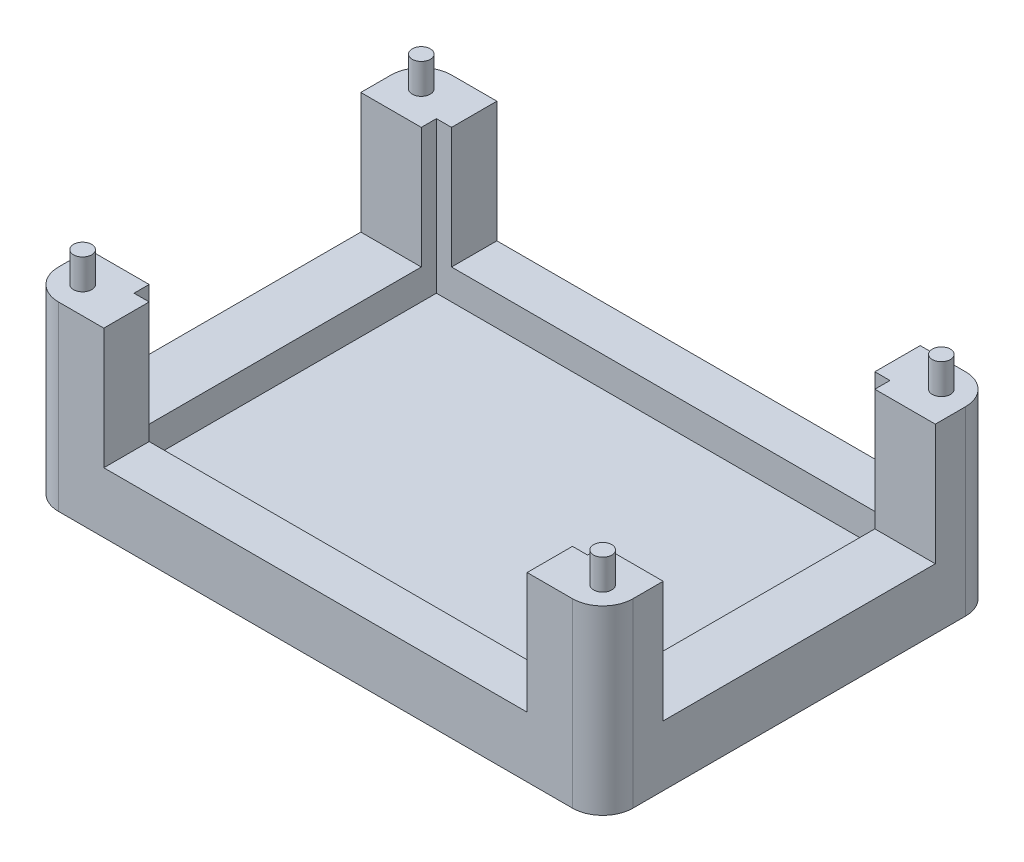
ISO-10303-21;
HEADER;
FILE_DESCRIPTION(('STEP AP214'),'2;1');
FILE_NAME('part.step','',(''),(''),'','','');
FILE_SCHEMA(('AUTOMOTIVE_DESIGN { 1 0 10303 214 1 1 1 1 }'));
ENDSEC;
DATA;
#1=APPLICATION_CONTEXT('core data for automotive mechanical design processes');
#2=APPLICATION_PROTOCOL_DEFINITION('international standard','automotive_design',2000,#1);
#3=PRODUCT_CONTEXT('',#1,'mechanical');
#4=PRODUCT('Part','Part','',(#3));
#5=PRODUCT_RELATED_PRODUCT_CATEGORY('part','',(#4));
#6=PRODUCT_DEFINITION_FORMATION('','',#4);
#7=PRODUCT_DEFINITION_CONTEXT('part definition',#1,'design');
#8=PRODUCT_DEFINITION('design','',#6,#7);
#9=PRODUCT_DEFINITION_SHAPE('','',#8);
#10=(LENGTH_UNIT() NAMED_UNIT(*) SI_UNIT(.MILLI.,.METRE.));
#11=(NAMED_UNIT(*) PLANE_ANGLE_UNIT() SI_UNIT($,.RADIAN.));
#12=(NAMED_UNIT(*) SI_UNIT($,.STERADIAN.) SOLID_ANGLE_UNIT());
#13=UNCERTAINTY_MEASURE_WITH_UNIT(LENGTH_MEASURE(1.E-05),#10,'distance_accuracy_value','');
#14=(GEOMETRIC_REPRESENTATION_CONTEXT(3) GLOBAL_UNCERTAINTY_ASSIGNED_CONTEXT((#13)) GLOBAL_UNIT_ASSIGNED_CONTEXT((#10,
#11,#12)) REPRESENTATION_CONTEXT('',''));
#15=CARTESIAN_POINT('',(0.,0.,0.));
#16=DIRECTION('',(0.,0.,1.));
#17=DIRECTION('',(1.,0.,0.));
#18=AXIS2_PLACEMENT_3D('',#15,#16,#17);
#19=CARTESIAN_POINT('',(0.,30.,0.));
#20=DIRECTION('',(0.,1.,0.));
#21=DIRECTION('',(0.,0.,1.));
#22=AXIS2_PLACEMENT_3D('',#19,#20,#21);
#23=PLANE('',#22);
#24=DIRECTION('',(0.,0.,-1.));
#25=VECTOR('',#24,1.);
#26=CARTESIAN_POINT('',(35.,30.,0.));
#27=LINE('',#26,#25);
#28=CARTESIAN_POINT('',(35.,30.,32.5));
#29=VERTEX_POINT('',#28);
#30=CARTESIAN_POINT('',(35.,30.,25.));
#31=VERTEX_POINT('',#30);
#32=EDGE_CURVE('E271',#29,#31,#27,.T.);
#33=ORIENTED_EDGE('',*,*,#32,.F.);
#34=DIRECTION('',(1.,0.,0.));
#35=VECTOR('',#34,1.);
#36=CARTESIAN_POINT('',(-47.5,30.,32.5));
#37=LINE('',#36,#35);
#38=CARTESIAN_POINT('',(42.5,30.,32.5));
#39=VERTEX_POINT('',#38);
#40=EDGE_CURVE('E383',#29,#39,#37,.T.);
#41=ORIENTED_EDGE('',*,*,#40,.T.);
#42=CARTESIAN_POINT('',(42.5,30.,27.5));
#43=DIRECTION('',(0.,1.,0.));
#44=DIRECTION('',(0.,0.,1.));
#45=AXIS2_PLACEMENT_3D('',#42,#43,#44);
#46=CIRCLE('',#45,5.);
#47=CARTESIAN_POINT('',(47.5,30.,27.5));
#48=VERTEX_POINT('',#47);
#49=EDGE_CURVE('E417',#39,#48,#46,.T.);
#50=ORIENTED_EDGE('',*,*,#49,.T.);
#51=DIRECTION('',(0.,0.,-1.));
#52=VECTOR('',#51,1.);
#53=CARTESIAN_POINT('',(47.5,30.,-32.5));
#54=LINE('',#53,#52);
#55=CARTESIAN_POINT('',(47.5,30.,22.5));
#56=VERTEX_POINT('',#55);
#57=EDGE_CURVE('E372',#48,#56,#54,.T.);
#58=ORIENTED_EDGE('',*,*,#57,.T.);
#59=DIRECTION('',(1.,0.,0.));
#60=VECTOR('',#59,1.);
#61=CARTESIAN_POINT('',(0.,30.,22.5));
#62=LINE('',#61,#60);
#63=CARTESIAN_POINT('',(37.5,30.,22.5));
#64=VERTEX_POINT('',#63);
#65=EDGE_CURVE('E308',#64,#56,#62,.T.);
#66=ORIENTED_EDGE('',*,*,#65,.F.);
#67=DIRECTION('',(0.,0.,-1.));
#68=VECTOR('',#67,1.);
#69=CARTESIAN_POINT('',(37.5,30.,-25.));
#70=LINE('',#69,#68);
#71=CARTESIAN_POINT('',(37.5,30.,25.));
#72=VERTEX_POINT('',#71);
#73=EDGE_CURVE('E344',#72,#64,#70,.T.);
#74=ORIENTED_EDGE('',*,*,#73,.F.);
#75=DIRECTION('',(1.,0.,0.));
#76=VECTOR('',#75,1.);
#77=CARTESIAN_POINT('',(-37.5,30.,25.));
#78=LINE('',#77,#76);
#79=EDGE_CURVE('E355',#31,#72,#78,.T.);
#80=ORIENTED_EDGE('',*,*,#79,.F.);
#81=EDGE_LOOP('',(#33,#41,#50,#58,#66,#74,#80));
#82=FACE_BOUND('',#81,.T.);
#83=CARTESIAN_POINT('',(43.,30.,28.));
#84=DIRECTION('',(0.,1.,0.));
#85=DIRECTION('',(0.,0.,1.));
#86=AXIS2_PLACEMENT_3D('',#83,#84,#85);
#87=CIRCLE('',#86,1.50000000000002);
#88=CARTESIAN_POINT('',(43.,30.,29.5));
#89=VERTEX_POINT('',#88);
#90=EDGE_CURVE('E318',#89,#89,#87,.T.);
#91=ORIENTED_EDGE('',*,*,#90,.F.);
#92=EDGE_LOOP('',(#91));
#93=FACE_BOUND('',#92,.T.);
#94=ADVANCED_FACE('F39',(#82,#93),#23,.T.);
#95=DIRECTION('',(0.,0.,-1.));
#96=VECTOR('',#95,1.);
#97=CARTESIAN_POINT('',(35.,30.,0.));
#98=LINE('',#97,#96);
#99=CARTESIAN_POINT('',(35.,30.,-25.));
#100=VERTEX_POINT('',#99);
#101=CARTESIAN_POINT('',(35.,30.,-32.5));
#102=VERTEX_POINT('',#101);
#103=EDGE_CURVE('E266',#100,#102,#98,.T.);
#104=ORIENTED_EDGE('',*,*,#103,.F.);
#105=DIRECTION('',(-1.,0.,0.));
#106=VECTOR('',#105,1.);
#107=CARTESIAN_POINT('',(-37.5,30.,-25.));
#108=LINE('',#107,#106);
#109=CARTESIAN_POINT('',(37.5,30.,-25.));
#110=VERTEX_POINT('',#109);
#111=EDGE_CURVE('E348',#110,#100,#108,.T.);
#112=ORIENTED_EDGE('',*,*,#111,.F.);
#113=CARTESIAN_POINT('',(37.5,30.,-22.5));
#114=VERTEX_POINT('',#113);
#115=EDGE_CURVE('E333',#114,#110,#70,.T.);
#116=ORIENTED_EDGE('',*,*,#115,.F.);
#117=DIRECTION('',(-1.,0.,0.));
#118=VECTOR('',#117,1.);
#119=CARTESIAN_POINT('',(0.,30.,-22.5));
#120=LINE('',#119,#118);
#121=CARTESIAN_POINT('',(47.5,30.,-22.5));
#122=VERTEX_POINT('',#121);
#123=EDGE_CURVE('E302',#122,#114,#120,.T.);
#124=ORIENTED_EDGE('',*,*,#123,.F.);
#125=CARTESIAN_POINT('',(47.5,30.,-27.5));
#126=VERTEX_POINT('',#125);
#127=EDGE_CURVE('E375',#122,#126,#54,.T.);
#128=ORIENTED_EDGE('',*,*,#127,.T.);
#129=CARTESIAN_POINT('',(42.5,30.,-27.5));
#130=DIRECTION('',(0.,1.,0.));
#131=DIRECTION('',(0.,0.,1.));
#132=AXIS2_PLACEMENT_3D('',#129,#130,#131);
#133=CIRCLE('',#132,5.);
#134=CARTESIAN_POINT('',(42.5,30.,-32.5));
#135=VERTEX_POINT('',#134);
#136=EDGE_CURVE('E419',#126,#135,#133,.T.);
#137=ORIENTED_EDGE('',*,*,#136,.T.);
#138=DIRECTION('',(-1.,0.,0.));
#139=VECTOR('',#138,1.);
#140=CARTESIAN_POINT('',(-47.5,30.,-32.5));
#141=LINE('',#140,#139);
#142=EDGE_CURVE('E376',#135,#102,#141,.T.);
#143=ORIENTED_EDGE('',*,*,#142,.T.);
#144=EDGE_LOOP('',(#104,#112,#116,#124,#128,#137,#143));
#145=FACE_BOUND('',#144,.T.);
#146=CARTESIAN_POINT('',(43.,30.,-28.));
#147=DIRECTION('',(0.,1.,0.));
#148=DIRECTION('',(0.,0.,1.));
#149=AXIS2_PLACEMENT_3D('',#146,#147,#148);
#150=CIRCLE('',#149,1.50000000000002);
#151=CARTESIAN_POINT('',(43.,30.,-26.5));
#152=VERTEX_POINT('',#151);
#153=EDGE_CURVE('E327',#152,#152,#150,.T.);
#154=ORIENTED_EDGE('',*,*,#153,.F.);
#155=EDGE_LOOP('',(#154));
#156=FACE_BOUND('',#155,.T.);
#157=ADVANCED_FACE('F455',(#145,#156),#23,.T.);
#158=DIRECTION('',(0.,0.,1.));
#159=VECTOR('',#158,1.);
#160=CARTESIAN_POINT('',(-35.,30.,0.));
#161=LINE('',#160,#159);
#162=CARTESIAN_POINT('',(-35.,30.,25.));
#163=VERTEX_POINT('',#162);
#164=CARTESIAN_POINT('',(-35.,30.,32.5));
#165=VERTEX_POINT('',#164);
#166=EDGE_CURVE('E261',#163,#165,#161,.T.);
#167=ORIENTED_EDGE('',*,*,#166,.F.);
#168=CARTESIAN_POINT('',(-37.5,30.,25.));
#169=VERTEX_POINT('',#168);
#170=EDGE_CURVE('E356',#169,#163,#78,.T.);
#171=ORIENTED_EDGE('',*,*,#170,.F.);
#172=DIRECTION('',(0.,0.,1.));
#173=VECTOR('',#172,1.);
#174=CARTESIAN_POINT('',(-37.5,30.,-25.));
#175=LINE('',#174,#173);
#176=CARTESIAN_POINT('',(-37.5,30.,22.5));
#177=VERTEX_POINT('',#176);
#178=EDGE_CURVE('E351',#177,#169,#175,.T.);
#179=ORIENTED_EDGE('',*,*,#178,.F.);
#180=CARTESIAN_POINT('',(-47.5,30.,22.5));
#181=VERTEX_POINT('',#180);
#182=EDGE_CURVE('E305',#181,#177,#62,.T.);
#183=ORIENTED_EDGE('',*,*,#182,.F.);
#184=DIRECTION('',(0.,0.,1.));
#185=VECTOR('',#184,1.);
#186=CARTESIAN_POINT('',(-47.5,30.,-32.5));
#187=LINE('',#186,#185);
#188=CARTESIAN_POINT('',(-47.5,30.,27.5));
#189=VERTEX_POINT('',#188);
#190=EDGE_CURVE('E379',#181,#189,#187,.T.);
#191=ORIENTED_EDGE('',*,*,#190,.T.);
#192=CARTESIAN_POINT('',(-42.5,30.,27.5));
#193=DIRECTION('',(0.,1.,0.));
#194=DIRECTION('',(0.,0.,1.));
#195=AXIS2_PLACEMENT_3D('',#192,#193,#194);
#196=CIRCLE('',#195,5.);
#197=CARTESIAN_POINT('',(-42.5,30.,32.5));
#198=VERTEX_POINT('',#197);
#199=EDGE_CURVE('E421',#189,#198,#196,.T.);
#200=ORIENTED_EDGE('',*,*,#199,.T.);
#201=EDGE_CURVE('E384',#198,#165,#37,.T.);
#202=ORIENTED_EDGE('',*,*,#201,.T.);
#203=EDGE_LOOP('',(#167,#171,#179,#183,#191,#200,#202));
#204=FACE_BOUND('',#203,.T.);
#205=CARTESIAN_POINT('',(-43.,30.,28.));
#206=DIRECTION('',(0.,1.,0.));
#207=DIRECTION('',(0.,0.,1.));
#208=AXIS2_PLACEMENT_3D('',#205,#206,#207);
#209=CIRCLE('',#208,1.49999999999999);
#210=CARTESIAN_POINT('',(-43.,30.,29.5));
#211=VERTEX_POINT('',#210);
#212=EDGE_CURVE('E311',#211,#211,#209,.T.);
#213=ORIENTED_EDGE('',*,*,#212,.F.);
#214=EDGE_LOOP('',(#213));
#215=FACE_BOUND('',#214,.T.);
#216=ADVANCED_FACE('F549',(#204,#215),#23,.T.);
#217=CARTESIAN_POINT('',(47.5,30.,-32.5));
#218=DIRECTION('',(-1.,0.,0.));
#219=DIRECTION('',(0.,0.,1.));
#220=AXIS2_PLACEMENT_3D('',#217,#218,#219);
#221=PLANE('',#220);
#222=DIRECTION('',(0.,0.,-1.));
#223=VECTOR('',#222,1.);
#224=CARTESIAN_POINT('',(47.5,10.,-22.5));
#225=LINE('',#224,#223);
#226=CARTESIAN_POINT('',(47.5,9.99999999999999,22.5));
#227=VERTEX_POINT('',#226);
#228=CARTESIAN_POINT('',(47.5,10.,-22.5));
#229=VERTEX_POINT('',#228);
#230=EDGE_CURVE('E286',#227,#229,#225,.T.);
#231=ORIENTED_EDGE('',*,*,#230,.F.);
#232=DIRECTION('',(0.,-1.,0.));
#233=VECTOR('',#232,1.);
#234=CARTESIAN_POINT('',(47.5,50.,22.5));
#235=LINE('',#234,#233);
#236=EDGE_CURVE('E273',#56,#227,#235,.T.);
#237=ORIENTED_EDGE('',*,*,#236,.F.);
#238=ORIENTED_EDGE('',*,*,#57,.F.);
#239=DIRECTION('',(0.,-1.,0.));
#240=VECTOR('',#239,1.);
#241=CARTESIAN_POINT('',(47.5,30.,27.5));
#242=LINE('',#241,#240);
#243=CARTESIAN_POINT('',(47.5,0.,27.5));
#244=VERTEX_POINT('',#243);
#245=EDGE_CURVE('E431',#48,#244,#242,.T.);
#246=ORIENTED_EDGE('',*,*,#245,.T.);
#247=DIRECTION('',(0.,0.,-1.));
#248=VECTOR('',#247,1.);
#249=CARTESIAN_POINT('',(47.5,0.,-32.5));
#250=LINE('',#249,#248);
#251=CARTESIAN_POINT('',(47.5,0.,-27.5));
#252=VERTEX_POINT('',#251);
#253=EDGE_CURVE('E371',#244,#252,#250,.T.);
#254=ORIENTED_EDGE('',*,*,#253,.T.);
#255=DIRECTION('',(0.,-1.,0.));
#256=VECTOR('',#255,1.);
#257=CARTESIAN_POINT('',(47.5,30.,-27.5));
#258=LINE('',#257,#256);
#259=EDGE_CURVE('E434',#252,#126,#258,.F.);
#260=ORIENTED_EDGE('',*,*,#259,.T.);
#261=ORIENTED_EDGE('',*,*,#127,.F.);
#262=DIRECTION('',(0.,1.,0.));
#263=VECTOR('',#262,1.);
#264=CARTESIAN_POINT('',(47.5,50.,-22.5));
#265=LINE('',#264,#263);
#266=EDGE_CURVE('E278',#229,#122,#265,.T.);
#267=ORIENTED_EDGE('',*,*,#266,.F.);
#268=EDGE_LOOP('',(#231,#237,#238,#246,#254,#260,#261,#267));
#269=FACE_BOUND('',#268,.T.);
#270=ADVANCED_FACE('F506',(#269),#221,.F.);
#271=CARTESIAN_POINT('',(-47.5,30.,-32.5));
#272=DIRECTION('',(0.,0.,1.));
#273=DIRECTION('',(1.,0.,0.));
#274=AXIS2_PLACEMENT_3D('',#271,#272,#273);
#275=PLANE('',#274);
#276=DIRECTION('',(1.,0.,0.));
#277=VECTOR('',#276,1.);
#278=CARTESIAN_POINT('',(-35.,9.99999999999999,-32.5));
#279=LINE('',#278,#277);
#280=CARTESIAN_POINT('',(-35.,9.99999999999999,-32.5));
#281=VERTEX_POINT('',#280);
#282=CARTESIAN_POINT('',(35.,9.99999999999999,-32.5));
#283=VERTEX_POINT('',#282);
#284=EDGE_CURVE('E233',#281,#283,#279,.T.);
#285=ORIENTED_EDGE('',*,*,#284,.T.);
#286=DIRECTION('',(0.,1.,0.));
#287=VECTOR('',#286,1.);
#288=CARTESIAN_POINT('',(35.,50.,-32.5));
#289=LINE('',#288,#287);
#290=EDGE_CURVE('E245',#283,#102,#289,.T.);
#291=ORIENTED_EDGE('',*,*,#290,.T.);
#292=ORIENTED_EDGE('',*,*,#142,.F.);
#293=DIRECTION('',(0.,-1.,0.));
#294=VECTOR('',#293,1.);
#295=CARTESIAN_POINT('',(42.5,30.,-32.5));
#296=LINE('',#295,#294);
#297=CARTESIAN_POINT('',(42.5,0.,-32.5));
#298=VERTEX_POINT('',#297);
#299=EDGE_CURVE('E412',#135,#298,#296,.T.);
#300=ORIENTED_EDGE('',*,*,#299,.T.);
#301=DIRECTION('',(-1.,0.,0.));
#302=VECTOR('',#301,1.);
#303=CARTESIAN_POINT('',(-47.5,0.,-32.5));
#304=LINE('',#303,#302);
#305=CARTESIAN_POINT('',(-42.5,0.,-32.5));
#306=VERTEX_POINT('',#305);
#307=EDGE_CURVE('E390',#298,#306,#304,.T.);
#308=ORIENTED_EDGE('',*,*,#307,.T.);
#309=DIRECTION('',(0.,-1.,0.));
#310=VECTOR('',#309,1.);
#311=CARTESIAN_POINT('',(-42.5,30.,-32.5));
#312=LINE('',#311,#310);
#313=CARTESIAN_POINT('',(-42.5,30.,-32.5));
#314=VERTEX_POINT('',#313);
#315=EDGE_CURVE('E415',#306,#314,#312,.F.);
#316=ORIENTED_EDGE('',*,*,#315,.T.);
#317=CARTESIAN_POINT('',(-35.,30.,-32.5));
#318=VERTEX_POINT('',#317);
#319=EDGE_CURVE('E244',#318,#314,#141,.T.);
#320=ORIENTED_EDGE('',*,*,#319,.F.);
#321=DIRECTION('',(0.,-1.,0.));
#322=VECTOR('',#321,1.);
#323=CARTESIAN_POINT('',(-35.,50.,-32.5));
#324=LINE('',#323,#322);
#325=EDGE_CURVE('E226',#318,#281,#324,.T.);
#326=ORIENTED_EDGE('',*,*,#325,.T.);
#327=EDGE_LOOP('',(#285,#291,#292,#300,#308,#316,#320,#326));
#328=FACE_BOUND('',#327,.T.);
#329=ADVANCED_FACE('F242',(#328),#275,.F.);
#330=CARTESIAN_POINT('',(-47.5,30.,-32.5));
#331=DIRECTION('',(1.,0.,0.));
#332=DIRECTION('',(0.,0.,-1.));
#333=AXIS2_PLACEMENT_3D('',#330,#331,#332);
#334=PLANE('',#333);
#335=ORIENTED_EDGE('',*,*,#190,.F.);
#336=DIRECTION('',(0.,-1.,0.));
#337=VECTOR('',#336,1.);
#338=CARTESIAN_POINT('',(-47.5,50.,22.5));
#339=LINE('',#338,#337);
#340=CARTESIAN_POINT('',(-47.5,9.99999999999999,22.5));
#341=VERTEX_POINT('',#340);
#342=EDGE_CURVE('E274',#181,#341,#339,.T.);
#343=ORIENTED_EDGE('',*,*,#342,.T.);
#344=DIRECTION('',(0.,0.,-1.));
#345=VECTOR('',#344,1.);
#346=CARTESIAN_POINT('',(-47.5,10.,-22.5));
#347=LINE('',#346,#345);
#348=CARTESIAN_POINT('',(-47.5,10.,-22.5));
#349=VERTEX_POINT('',#348);
#350=EDGE_CURVE('E277',#341,#349,#347,.T.);
#351=ORIENTED_EDGE('',*,*,#350,.T.);
#352=DIRECTION('',(0.,1.,0.));
#353=VECTOR('',#352,1.);
#354=CARTESIAN_POINT('',(-47.5,50.,-22.5));
#355=LINE('',#354,#353);
#356=CARTESIAN_POINT('',(-47.5,30.,-22.5));
#357=VERTEX_POINT('',#356);
#358=EDGE_CURVE('E281',#349,#357,#355,.T.);
#359=ORIENTED_EDGE('',*,*,#358,.T.);
#360=CARTESIAN_POINT('',(-47.5,30.,-27.5));
#361=VERTEX_POINT('',#360);
#362=EDGE_CURVE('E380',#361,#357,#187,.T.);
#363=ORIENTED_EDGE('',*,*,#362,.F.);
#364=DIRECTION('',(0.,-1.,0.));
#365=VECTOR('',#364,1.);
#366=CARTESIAN_POINT('',(-47.5,30.,-27.5));
#367=LINE('',#366,#365);
#368=CARTESIAN_POINT('',(-47.5,0.,-27.5));
#369=VERTEX_POINT('',#368);
#370=EDGE_CURVE('E401',#361,#369,#367,.T.);
#371=ORIENTED_EDGE('',*,*,#370,.T.);
#372=DIRECTION('',(0.,0.,1.));
#373=VECTOR('',#372,1.);
#374=CARTESIAN_POINT('',(-47.5,0.,-32.5));
#375=LINE('',#374,#373);
#376=CARTESIAN_POINT('',(-47.5,0.,27.5));
#377=VERTEX_POINT('',#376);
#378=EDGE_CURVE('E393',#369,#377,#375,.T.);
#379=ORIENTED_EDGE('',*,*,#378,.T.);
#380=DIRECTION('',(0.,-1.,0.));
#381=VECTOR('',#380,1.);
#382=CARTESIAN_POINT('',(-47.5,30.,27.5));
#383=LINE('',#382,#381);
#384=EDGE_CURVE('E387',#377,#189,#383,.F.);
#385=ORIENTED_EDGE('',*,*,#384,.T.);
#386=EDGE_LOOP('',(#335,#343,#351,#359,#363,#371,#379,#385));
#387=FACE_BOUND('',#386,.T.);
#388=ADVANCED_FACE('F477',(#387),#334,.F.);
#389=CARTESIAN_POINT('',(-47.5,30.,32.5));
#390=DIRECTION('',(0.,0.,-1.));
#391=DIRECTION('',(-1.,0.,0.));
#392=AXIS2_PLACEMENT_3D('',#389,#390,#391);
#393=PLANE('',#392);
#394=ORIENTED_EDGE('',*,*,#40,.F.);
#395=DIRECTION('',(0.,1.,0.));
#396=VECTOR('',#395,1.);
#397=CARTESIAN_POINT('',(35.,50.,32.5));
#398=LINE('',#397,#396);
#399=CARTESIAN_POINT('',(35.,9.99999999999999,32.5));
#400=VERTEX_POINT('',#399);
#401=EDGE_CURVE('E250',#400,#29,#398,.T.);
#402=ORIENTED_EDGE('',*,*,#401,.F.);
#403=DIRECTION('',(1.,0.,0.));
#404=VECTOR('',#403,1.);
#405=CARTESIAN_POINT('',(-35.,9.99999999999999,32.5));
#406=LINE('',#405,#404);
#407=CARTESIAN_POINT('',(-35.,9.99999999999999,32.5));
#408=VERTEX_POINT('',#407);
#409=EDGE_CURVE('E247',#408,#400,#406,.T.);
#410=ORIENTED_EDGE('',*,*,#409,.F.);
#411=DIRECTION('',(0.,-1.,0.));
#412=VECTOR('',#411,1.);
#413=CARTESIAN_POINT('',(-35.,50.,32.5));
#414=LINE('',#413,#412);
#415=EDGE_CURVE('E252',#165,#408,#414,.T.);
#416=ORIENTED_EDGE('',*,*,#415,.F.);
#417=ORIENTED_EDGE('',*,*,#201,.F.);
#418=DIRECTION('',(0.,-1.,0.));
#419=VECTOR('',#418,1.);
#420=CARTESIAN_POINT('',(-42.5,30.,32.5));
#421=LINE('',#420,#419);
#422=CARTESIAN_POINT('',(-42.5,0.,32.5));
#423=VERTEX_POINT('',#422);
#424=EDGE_CURVE('E428',#198,#423,#421,.T.);
#425=ORIENTED_EDGE('',*,*,#424,.T.);
#426=DIRECTION('',(1.,0.,0.));
#427=VECTOR('',#426,1.);
#428=CARTESIAN_POINT('',(-47.5,0.,32.5));
#429=LINE('',#428,#427);
#430=CARTESIAN_POINT('',(42.5,0.,32.5));
#431=VERTEX_POINT('',#430);
#432=EDGE_CURVE('E396',#423,#431,#429,.T.);
#433=ORIENTED_EDGE('',*,*,#432,.T.);
#434=DIRECTION('',(0.,-1.,0.));
#435=VECTOR('',#434,1.);
#436=CARTESIAN_POINT('',(42.5,30.,32.5));
#437=LINE('',#436,#435);
#438=EDGE_CURVE('E425',#431,#39,#437,.F.);
#439=ORIENTED_EDGE('',*,*,#438,.T.);
#440=EDGE_LOOP('',(#394,#402,#410,#416,#417,#425,#433,#439));
#441=FACE_BOUND('',#440,.T.);
#442=ADVANCED_FACE('F515',(#441),#393,.F.);
#443=DIRECTION('',(0.,0.,1.));
#444=VECTOR('',#443,1.);
#445=CARTESIAN_POINT('',(-35.,30.,0.));
#446=LINE('',#445,#444);
#447=CARTESIAN_POINT('',(-35.,30.,-25.));
#448=VERTEX_POINT('',#447);
#449=EDGE_CURVE('E62',#318,#448,#446,.T.);
#450=ORIENTED_EDGE('',*,*,#449,.F.);
#451=ORIENTED_EDGE('',*,*,#319,.T.);
#452=CARTESIAN_POINT('',(-42.5,30.,-27.5));
#453=DIRECTION('',(0.,1.,0.));
#454=DIRECTION('',(0.,0.,1.));
#455=AXIS2_PLACEMENT_3D('',#452,#453,#454);
#456=CIRCLE('',#455,5.);
#457=EDGE_CURVE('E423',#314,#361,#456,.T.);
#458=ORIENTED_EDGE('',*,*,#457,.T.);
#459=ORIENTED_EDGE('',*,*,#362,.T.);
#460=CARTESIAN_POINT('',(-37.5,30.,-22.5));
#461=VERTEX_POINT('',#460);
#462=EDGE_CURVE('E299',#461,#357,#120,.T.);
#463=ORIENTED_EDGE('',*,*,#462,.F.);
#464=CARTESIAN_POINT('',(-37.5,30.,-25.));
#465=VERTEX_POINT('',#464);
#466=EDGE_CURVE('E352',#465,#461,#175,.T.);
#467=ORIENTED_EDGE('',*,*,#466,.F.);
#468=EDGE_CURVE('E347',#448,#465,#108,.T.);
#469=ORIENTED_EDGE('',*,*,#468,.F.);
#470=EDGE_LOOP('',(#450,#451,#458,#459,#463,#467,#469));
#471=FACE_BOUND('',#470,.T.);
#472=CARTESIAN_POINT('',(-43.,30.,-28.));
#473=DIRECTION('',(0.,1.,0.));
#474=DIRECTION('',(0.,0.,1.));
#475=AXIS2_PLACEMENT_3D('',#472,#473,#474);
#476=CIRCLE('',#475,1.5);
#477=CARTESIAN_POINT('',(-43.,30.,-26.5));
#478=VERTEX_POINT('',#477);
#479=EDGE_CURVE('E324',#478,#478,#476,.T.);
#480=ORIENTED_EDGE('',*,*,#479,.F.);
#481=EDGE_LOOP('',(#480));
#482=FACE_BOUND('',#481,.T.);
#483=ADVANCED_FACE('F482',(#471,#482),#23,.T.);
#484=CARTESIAN_POINT('',(0.,0.,0.));
#485=DIRECTION('',(0.,1.,0.));
#486=DIRECTION('',(0.,0.,1.));
#487=AXIS2_PLACEMENT_3D('',#484,#485,#486);
#488=PLANE('',#487);
#489=ORIENTED_EDGE('',*,*,#378,.F.);
#490=CARTESIAN_POINT('',(-42.5,0.,-27.5));
#491=DIRECTION('',(0.,1.,0.));
#492=DIRECTION('',(0.,0.,1.));
#493=AXIS2_PLACEMENT_3D('',#490,#491,#492);
#494=CIRCLE('',#493,5.);
#495=EDGE_CURVE('E410',#369,#306,#494,.F.);
#496=ORIENTED_EDGE('',*,*,#495,.T.);
#497=ORIENTED_EDGE('',*,*,#307,.F.);
#498=CARTESIAN_POINT('',(42.5,0.,-27.5));
#499=DIRECTION('',(0.,1.,0.));
#500=DIRECTION('',(0.,0.,1.));
#501=AXIS2_PLACEMENT_3D('',#498,#499,#500);
#502=CIRCLE('',#501,5.);
#503=EDGE_CURVE('E406',#298,#252,#502,.F.);
#504=ORIENTED_EDGE('',*,*,#503,.T.);
#505=ORIENTED_EDGE('',*,*,#253,.F.);
#506=CARTESIAN_POINT('',(42.5,0.,27.5));
#507=DIRECTION('',(0.,1.,0.));
#508=DIRECTION('',(0.,0.,1.));
#509=AXIS2_PLACEMENT_3D('',#506,#507,#508);
#510=CIRCLE('',#509,5.);
#511=EDGE_CURVE('E404',#244,#431,#510,.F.);
#512=ORIENTED_EDGE('',*,*,#511,.T.);
#513=ORIENTED_EDGE('',*,*,#432,.F.);
#514=CARTESIAN_POINT('',(-42.5,0.,27.5));
#515=DIRECTION('',(0.,1.,0.));
#516=DIRECTION('',(0.,0.,1.));
#517=AXIS2_PLACEMENT_3D('',#514,#515,#516);
#518=CIRCLE('',#517,5.);
#519=EDGE_CURVE('E408',#423,#377,#518,.F.);
#520=ORIENTED_EDGE('',*,*,#519,.T.);
#521=EDGE_LOOP('',(#489,#496,#497,#504,#505,#512,#513,#520));
#522=FACE_BOUND('',#521,.T.);
#523=ADVANCED_FACE('F468',(#522),#488,.F.);
#524=CARTESIAN_POINT('',(-42.5,30.,-27.5));
#525=DIRECTION('',(0.,-1.,0.));
#526=DIRECTION('',(0.,0.,-1.));
#527=AXIS2_PLACEMENT_3D('',#524,#525,#526);
#528=CYLINDRICAL_SURFACE('',#527,5.);
#529=ORIENTED_EDGE('',*,*,#457,.F.);
#530=ORIENTED_EDGE('',*,*,#315,.F.);
#531=ORIENTED_EDGE('',*,*,#495,.F.);
#532=ORIENTED_EDGE('',*,*,#370,.F.);
#533=EDGE_LOOP('',(#529,#530,#531,#532));
#534=FACE_BOUND('',#533,.T.);
#535=ADVANCED_FACE('F473',(#534),#528,.T.);
#536=CARTESIAN_POINT('',(-42.5,30.,27.5));
#537=DIRECTION('',(0.,-1.,0.));
#538=DIRECTION('',(0.,0.,-1.));
#539=AXIS2_PLACEMENT_3D('',#536,#537,#538);
#540=CYLINDRICAL_SURFACE('',#539,5.);
#541=ORIENTED_EDGE('',*,*,#199,.F.);
#542=ORIENTED_EDGE('',*,*,#384,.F.);
#543=ORIENTED_EDGE('',*,*,#519,.F.);
#544=ORIENTED_EDGE('',*,*,#424,.F.);
#545=EDGE_LOOP('',(#541,#542,#543,#544));
#546=FACE_BOUND('',#545,.T.);
#547=ADVANCED_FACE('F621',(#546),#540,.T.);
#548=CARTESIAN_POINT('',(42.5,30.,-27.5));
#549=DIRECTION('',(0.,-1.,0.));
#550=DIRECTION('',(0.,0.,-1.));
#551=AXIS2_PLACEMENT_3D('',#548,#549,#550);
#552=CYLINDRICAL_SURFACE('',#551,5.);
#553=ORIENTED_EDGE('',*,*,#136,.F.);
#554=ORIENTED_EDGE('',*,*,#259,.F.);
#555=ORIENTED_EDGE('',*,*,#503,.F.);
#556=ORIENTED_EDGE('',*,*,#299,.F.);
#557=EDGE_LOOP('',(#553,#554,#555,#556));
#558=FACE_BOUND('',#557,.T.);
#559=ADVANCED_FACE('F463',(#558),#552,.T.);
#560=CARTESIAN_POINT('',(42.5,30.,27.5));
#561=DIRECTION('',(0.,-1.,0.));
#562=DIRECTION('',(0.,0.,-1.));
#563=AXIS2_PLACEMENT_3D('',#560,#561,#562);
#564=CYLINDRICAL_SURFACE('',#563,5.);
#565=ORIENTED_EDGE('',*,*,#49,.F.);
#566=ORIENTED_EDGE('',*,*,#438,.F.);
#567=ORIENTED_EDGE('',*,*,#511,.F.);
#568=ORIENTED_EDGE('',*,*,#245,.F.);
#569=EDGE_LOOP('',(#565,#566,#567,#568));
#570=FACE_BOUND('',#569,.T.);
#571=ADVANCED_FACE('F41',(#570),#564,.T.);
#572=CARTESIAN_POINT('',(37.5,-90.1387818865997,-25.));
#573=DIRECTION('',(1.,0.,0.));
#574=DIRECTION('',(0.,0.,-1.));
#575=AXIS2_PLACEMENT_3D('',#572,#573,#574);
#576=PLANE('',#575);
#577=ORIENTED_EDGE('',*,*,#73,.T.);
#578=DIRECTION('',(0.,-1.,0.));
#579=VECTOR('',#578,1.);
#580=CARTESIAN_POINT('',(37.5,-90.1387818865997,22.5));
#581=LINE('',#580,#579);
#582=CARTESIAN_POINT('',(37.5,9.99999999999999,22.5));
#583=VERTEX_POINT('',#582);
#584=EDGE_CURVE('E307',#64,#583,#581,.T.);
#585=ORIENTED_EDGE('',*,*,#584,.T.);
#586=DIRECTION('',(0.,0.,-1.));
#587=VECTOR('',#586,1.);
#588=CARTESIAN_POINT('',(37.5,9.99999999999999,-25.));
#589=LINE('',#588,#587);
#590=CARTESIAN_POINT('',(37.5,9.99999999999999,-22.5));
#591=VERTEX_POINT('',#590);
#592=EDGE_CURVE('E293',#583,#591,#589,.T.);
#593=ORIENTED_EDGE('',*,*,#592,.T.);
#594=DIRECTION('',(0.,1.,0.));
#595=VECTOR('',#594,1.);
#596=CARTESIAN_POINT('',(37.5,-90.1387818865997,-22.5));
#597=LINE('',#596,#595);
#598=EDGE_CURVE('E301',#591,#114,#597,.T.);
#599=ORIENTED_EDGE('',*,*,#598,.T.);
#600=ORIENTED_EDGE('',*,*,#115,.T.);
#601=DIRECTION('',(0.,1.,0.));
#602=VECTOR('',#601,1.);
#603=CARTESIAN_POINT('',(37.5,-90.1387818865997,-25.));
#604=LINE('',#603,#602);
#605=CARTESIAN_POINT('',(37.5,5.,-25.));
#606=VERTEX_POINT('',#605);
#607=EDGE_CURVE('E359',#606,#110,#604,.T.);
#608=ORIENTED_EDGE('',*,*,#607,.F.);
#609=DIRECTION('',(0.,0.,1.));
#610=VECTOR('',#609,1.);
#611=CARTESIAN_POINT('',(37.5,5.,-25.));
#612=LINE('',#611,#610);
#613=CARTESIAN_POINT('',(37.5,5.,25.));
#614=VERTEX_POINT('',#613);
#615=EDGE_CURVE('E341',#606,#614,#612,.T.);
#616=ORIENTED_EDGE('',*,*,#615,.T.);
#617=DIRECTION('',(0.,1.,0.));
#618=VECTOR('',#617,1.);
#619=CARTESIAN_POINT('',(37.5,-90.1387818865997,25.));
#620=LINE('',#619,#618);
#621=EDGE_CURVE('E339',#614,#72,#620,.T.);
#622=ORIENTED_EDGE('',*,*,#621,.T.);
#623=EDGE_LOOP('',(#577,#585,#593,#599,#600,#608,#616,#622));
#624=FACE_BOUND('',#623,.T.);
#625=ADVANCED_FACE('F499',(#624),#576,.F.);
#626=CARTESIAN_POINT('',(-37.5,-90.1387818865997,25.));
#627=DIRECTION('',(0.,0.,1.));
#628=DIRECTION('',(1.,0.,0.));
#629=AXIS2_PLACEMENT_3D('',#626,#627,#628);
#630=PLANE('',#629);
#631=DIRECTION('',(1.,0.,0.));
#632=VECTOR('',#631,1.);
#633=CARTESIAN_POINT('',(-37.5,9.99999999999999,25.));
#634=LINE('',#633,#632);
#635=CARTESIAN_POINT('',(-35.,9.99999999999999,25.));
#636=VERTEX_POINT('',#635);
#637=CARTESIAN_POINT('',(35.,9.99999999999999,25.));
#638=VERTEX_POINT('',#637);
#639=EDGE_CURVE('E263',#636,#638,#634,.T.);
#640=ORIENTED_EDGE('',*,*,#639,.T.);
#641=DIRECTION('',(0.,1.,0.));
#642=VECTOR('',#641,1.);
#643=CARTESIAN_POINT('',(35.,-90.1387818865997,25.));
#644=LINE('',#643,#642);
#645=EDGE_CURVE('E268',#638,#31,#644,.T.);
#646=ORIENTED_EDGE('',*,*,#645,.T.);
#647=ORIENTED_EDGE('',*,*,#79,.T.);
#648=ORIENTED_EDGE('',*,*,#621,.F.);
#649=DIRECTION('',(-1.,0.,0.));
#650=VECTOR('',#649,1.);
#651=CARTESIAN_POINT('',(-37.5,5.,25.));
#652=LINE('',#651,#650);
#653=CARTESIAN_POINT('',(-37.5,5.,25.));
#654=VERTEX_POINT('',#653);
#655=EDGE_CURVE('E338',#614,#654,#652,.T.);
#656=ORIENTED_EDGE('',*,*,#655,.T.);
#657=DIRECTION('',(0.,1.,0.));
#658=VECTOR('',#657,1.);
#659=CARTESIAN_POINT('',(-37.5,-90.1387818865997,25.));
#660=LINE('',#659,#658);
#661=EDGE_CURVE('E362',#654,#169,#660,.T.);
#662=ORIENTED_EDGE('',*,*,#661,.T.);
#663=ORIENTED_EDGE('',*,*,#170,.T.);
#664=DIRECTION('',(0.,-1.,0.));
#665=VECTOR('',#664,1.);
#666=CARTESIAN_POINT('',(-35.,-90.1387818865997,25.));
#667=LINE('',#666,#665);
#668=EDGE_CURVE('E258',#163,#636,#667,.T.);
#669=ORIENTED_EDGE('',*,*,#668,.T.);
#670=EDGE_LOOP('',(#640,#646,#647,#648,#656,#662,#663,#669));
#671=FACE_BOUND('',#670,.T.);
#672=ADVANCED_FACE('F607',(#671),#630,.F.);
#673=CARTESIAN_POINT('',(-37.5,-90.1387818865997,-25.));
#674=DIRECTION('',(-1.,0.,0.));
#675=DIRECTION('',(0.,0.,1.));
#676=AXIS2_PLACEMENT_3D('',#673,#674,#675);
#677=PLANE('',#676);
#678=DIRECTION('',(0.,0.,1.));
#679=VECTOR('',#678,1.);
#680=CARTESIAN_POINT('',(-37.5,9.99999999999999,-25.));
#681=LINE('',#680,#679);
#682=CARTESIAN_POINT('',(-37.5,10.,-22.5));
#683=VERTEX_POINT('',#682);
#684=CARTESIAN_POINT('',(-37.5,9.99999999999999,22.5));
#685=VERTEX_POINT('',#684);
#686=EDGE_CURVE('E437',#683,#685,#681,.T.);
#687=ORIENTED_EDGE('',*,*,#686,.T.);
#688=DIRECTION('',(0.,1.,0.));
#689=VECTOR('',#688,1.);
#690=CARTESIAN_POINT('',(-37.5,-90.1387818865997,22.5));
#691=LINE('',#690,#689);
#692=EDGE_CURVE('E443',#685,#177,#691,.T.);
#693=ORIENTED_EDGE('',*,*,#692,.T.);
#694=ORIENTED_EDGE('',*,*,#178,.T.);
#695=ORIENTED_EDGE('',*,*,#661,.F.);
#696=DIRECTION('',(0.,0.,-1.));
#697=VECTOR('',#696,1.);
#698=CARTESIAN_POINT('',(-37.5,5.,-25.));
#699=LINE('',#698,#697);
#700=CARTESIAN_POINT('',(-37.5,5.,-25.));
#701=VERTEX_POINT('',#700);
#702=EDGE_CURVE('E336',#654,#701,#699,.T.);
#703=ORIENTED_EDGE('',*,*,#702,.T.);
#704=DIRECTION('',(0.,1.,0.));
#705=VECTOR('',#704,1.);
#706=CARTESIAN_POINT('',(-37.5,-90.1387818865997,-25.));
#707=LINE('',#706,#705);
#708=EDGE_CURVE('E365',#701,#465,#707,.T.);
#709=ORIENTED_EDGE('',*,*,#708,.T.);
#710=ORIENTED_EDGE('',*,*,#466,.T.);
#711=DIRECTION('',(0.,-1.,0.));
#712=VECTOR('',#711,1.);
#713=CARTESIAN_POINT('',(-37.5,-90.1387818865997,-22.5));
#714=LINE('',#713,#712);
#715=EDGE_CURVE('E440',#461,#683,#714,.T.);
#716=ORIENTED_EDGE('',*,*,#715,.T.);
#717=EDGE_LOOP('',(#687,#693,#694,#695,#703,#709,#710,#716));
#718=FACE_BOUND('',#717,.T.);
#719=ADVANCED_FACE('F488',(#718),#677,.F.);
#720=CARTESIAN_POINT('',(-37.5,-90.1387818865997,-25.));
#721=DIRECTION('',(0.,0.,-1.));
#722=DIRECTION('',(-1.,0.,0.));
#723=AXIS2_PLACEMENT_3D('',#720,#721,#722);
#724=PLANE('',#723);
#725=ORIENTED_EDGE('',*,*,#111,.T.);
#726=DIRECTION('',(0.,-1.,0.));
#727=VECTOR('',#726,1.);
#728=CARTESIAN_POINT('',(35.,-90.1387818865997,-25.));
#729=LINE('',#728,#727);
#730=CARTESIAN_POINT('',(35.,9.99999999999999,-25.));
#731=VERTEX_POINT('',#730);
#732=EDGE_CURVE('E12',#100,#731,#729,.T.);
#733=ORIENTED_EDGE('',*,*,#732,.T.);
#734=DIRECTION('',(-1.,0.,0.));
#735=VECTOR('',#734,1.);
#736=CARTESIAN_POINT('',(-37.5,9.99999999999999,-25.));
#737=LINE('',#736,#735);
#738=CARTESIAN_POINT('',(-35.,9.99999999999999,-25.));
#739=VERTEX_POINT('',#738);
#740=EDGE_CURVE('E47',#731,#739,#737,.T.);
#741=ORIENTED_EDGE('',*,*,#740,.T.);
#742=DIRECTION('',(0.,1.,0.));
#743=VECTOR('',#742,1.);
#744=CARTESIAN_POINT('',(-35.,-90.1387818865997,-25.));
#745=LINE('',#744,#743);
#746=EDGE_CURVE('E227',#739,#448,#745,.T.);
#747=ORIENTED_EDGE('',*,*,#746,.T.);
#748=ORIENTED_EDGE('',*,*,#468,.T.);
#749=ORIENTED_EDGE('',*,*,#708,.F.);
#750=DIRECTION('',(1.,0.,0.));
#751=VECTOR('',#750,1.);
#752=CARTESIAN_POINT('',(-37.5,5.,-25.));
#753=LINE('',#752,#751);
#754=EDGE_CURVE('E343',#701,#606,#753,.T.);
#755=ORIENTED_EDGE('',*,*,#754,.T.);
#756=ORIENTED_EDGE('',*,*,#607,.T.);
#757=EDGE_LOOP('',(#725,#733,#741,#747,#748,#749,#755,#756));
#758=FACE_BOUND('',#757,.T.);
#759=ADVANCED_FACE('F447',(#758),#724,.F.);
#760=CARTESIAN_POINT('',(0.,5.,0.));
#761=DIRECTION('',(0.,1.,0.));
#762=DIRECTION('',(0.,0.,1.));
#763=AXIS2_PLACEMENT_3D('',#760,#761,#762);
#764=PLANE('',#763);
#765=ORIENTED_EDGE('',*,*,#615,.F.);
#766=ORIENTED_EDGE('',*,*,#754,.F.);
#767=ORIENTED_EDGE('',*,*,#702,.F.);
#768=ORIENTED_EDGE('',*,*,#655,.F.);
#769=EDGE_LOOP('',(#765,#766,#767,#768));
#770=FACE_BOUND('',#769,.T.);
#771=ADVANCED_FACE('F494',(#770),#764,.T.);
#772=CARTESIAN_POINT('',(43.,35.,-28.));
#773=DIRECTION('',(0.,-1.,0.));
#774=DIRECTION('',(0.,0.,-1.));
#775=AXIS2_PLACEMENT_3D('',#772,#773,#774);
#776=CYLINDRICAL_SURFACE('',#775,1.50000000000002);
#777=CARTESIAN_POINT('',(43.,35.,-28.));
#778=DIRECTION('',(0.,1.,0.));
#779=DIRECTION('',(0.,0.,1.));
#780=AXIS2_PLACEMENT_3D('',#777,#778,#779);
#781=CIRCLE('',#780,1.50000000000002);
#782=CARTESIAN_POINT('',(43.,35.,-26.5));
#783=VERTEX_POINT('',#782);
#784=EDGE_CURVE('E330',#783,#783,#781,.T.);
#785=ORIENTED_EDGE('',*,*,#784,.F.);
#786=EDGE_LOOP('',(#785));
#787=FACE_BOUND('',#786,.T.);
#788=ORIENTED_EDGE('',*,*,#153,.T.);
#789=EDGE_LOOP('',(#788));
#790=FACE_BOUND('',#789,.T.);
#791=ADVANCED_FACE('F600',(#787,#790),#776,.T.);
#792=CARTESIAN_POINT('',(43.,35.,-28.));
#793=DIRECTION('',(0.,1.,0.));
#794=DIRECTION('',(0.,0.,1.));
#795=AXIS2_PLACEMENT_3D('',#792,#793,#794);
#796=PLANE('',#795);
#797=ORIENTED_EDGE('',*,*,#784,.T.);
#798=EDGE_LOOP('',(#797));
#799=FACE_BOUND('',#798,.T.);
#800=ADVANCED_FACE('F593',(#799),#796,.T.);
#801=CARTESIAN_POINT('',(-43.,35.,-28.));
#802=DIRECTION('',(0.,-1.,0.));
#803=DIRECTION('',(0.,0.,-1.));
#804=AXIS2_PLACEMENT_3D('',#801,#802,#803);
#805=CYLINDRICAL_SURFACE('',#804,1.5);
#806=CARTESIAN_POINT('',(-43.,35.,-28.));
#807=DIRECTION('',(0.,1.,0.));
#808=DIRECTION('',(0.,0.,1.));
#809=AXIS2_PLACEMENT_3D('',#806,#807,#808);
#810=CIRCLE('',#809,1.5);
#811=CARTESIAN_POINT('',(-43.,35.,-26.5));
#812=VERTEX_POINT('',#811);
#813=EDGE_CURVE('E321',#812,#812,#810,.T.);
#814=ORIENTED_EDGE('',*,*,#813,.F.);
#815=EDGE_LOOP('',(#814));
#816=FACE_BOUND('',#815,.T.);
#817=ORIENTED_EDGE('',*,*,#479,.T.);
#818=EDGE_LOOP('',(#817));
#819=FACE_BOUND('',#818,.T.);
#820=ADVANCED_FACE('F590',(#816,#819),#805,.T.);
#821=CARTESIAN_POINT('',(-43.,35.,-28.));
#822=DIRECTION('',(0.,1.,0.));
#823=DIRECTION('',(0.,0.,1.));
#824=AXIS2_PLACEMENT_3D('',#821,#822,#823);
#825=PLANE('',#824);
#826=ORIENTED_EDGE('',*,*,#813,.T.);
#827=EDGE_LOOP('',(#826));
#828=FACE_BOUND('',#827,.T.);
#829=ADVANCED_FACE('F587',(#828),#825,.T.);
#830=CARTESIAN_POINT('',(43.,35.,28.));
#831=DIRECTION('',(0.,-1.,0.));
#832=DIRECTION('',(0.,0.,-1.));
#833=AXIS2_PLACEMENT_3D('',#830,#831,#832);
#834=CYLINDRICAL_SURFACE('',#833,1.50000000000002);
#835=CARTESIAN_POINT('',(43.,35.,28.));
#836=DIRECTION('',(0.,1.,0.));
#837=DIRECTION('',(0.,0.,1.));
#838=AXIS2_PLACEMENT_3D('',#835,#836,#837);
#839=CIRCLE('',#838,1.50000000000002);
#840=CARTESIAN_POINT('',(43.,35.,29.5));
#841=VERTEX_POINT('',#840);
#842=EDGE_CURVE('E314',#841,#841,#839,.T.);
#843=ORIENTED_EDGE('',*,*,#842,.F.);
#844=EDGE_LOOP('',(#843));
#845=FACE_BOUND('',#844,.T.);
#846=ORIENTED_EDGE('',*,*,#90,.T.);
#847=EDGE_LOOP('',(#846));
#848=FACE_BOUND('',#847,.T.);
#849=ADVANCED_FACE('F580',(#845,#848),#834,.T.);
#850=CARTESIAN_POINT('',(43.,35.,28.));
#851=DIRECTION('',(0.,1.,0.));
#852=DIRECTION('',(0.,0.,1.));
#853=AXIS2_PLACEMENT_3D('',#850,#851,#852);
#854=PLANE('',#853);
#855=ORIENTED_EDGE('',*,*,#842,.T.);
#856=EDGE_LOOP('',(#855));
#857=FACE_BOUND('',#856,.T.);
#858=ADVANCED_FACE('F571',(#857),#854,.T.);
#859=CARTESIAN_POINT('',(-43.,35.,28.));
#860=DIRECTION('',(0.,-1.,0.));
#861=DIRECTION('',(0.,0.,-1.));
#862=AXIS2_PLACEMENT_3D('',#859,#860,#861);
#863=CYLINDRICAL_SURFACE('',#862,1.49999999999999);
#864=CARTESIAN_POINT('',(-43.,35.,28.));
#865=DIRECTION('',(0.,1.,0.));
#866=DIRECTION('',(0.,0.,1.));
#867=AXIS2_PLACEMENT_3D('',#864,#865,#866);
#868=CIRCLE('',#867,1.49999999999999);
#869=CARTESIAN_POINT('',(-43.,35.,29.5));
#870=VERTEX_POINT('',#869);
#871=EDGE_CURVE('E315',#870,#870,#868,.T.);
#872=ORIENTED_EDGE('',*,*,#871,.F.);
#873=EDGE_LOOP('',(#872));
#874=FACE_BOUND('',#873,.T.);
#875=ORIENTED_EDGE('',*,*,#212,.T.);
#876=EDGE_LOOP('',(#875));
#877=FACE_BOUND('',#876,.T.);
#878=ADVANCED_FACE('F569',(#874,#877),#863,.T.);
#879=CARTESIAN_POINT('',(-43.,35.,28.));
#880=DIRECTION('',(0.,1.,0.));
#881=DIRECTION('',(0.,0.,1.));
#882=AXIS2_PLACEMENT_3D('',#879,#880,#881);
#883=PLANE('',#882);
#884=ORIENTED_EDGE('',*,*,#871,.T.);
#885=EDGE_LOOP('',(#884));
#886=FACE_BOUND('',#885,.T.);
#887=ADVANCED_FACE('F542',(#886),#883,.T.);
#888=CARTESIAN_POINT('',(-47.5,10.,-22.5));
#889=DIRECTION('',(0.,-1.,0.));
#890=DIRECTION('',(0.,0.,-1.));
#891=AXIS2_PLACEMENT_3D('',#888,#889,#890);
#892=PLANE('',#891);
#893=DIRECTION('',(1.,0.,0.));
#894=VECTOR('',#893,1.);
#895=CARTESIAN_POINT('',(-47.5,10.,-22.5));
#896=LINE('',#895,#894);
#897=EDGE_CURVE('E290',#349,#683,#896,.T.);
#898=ORIENTED_EDGE('',*,*,#897,.F.);
#899=ORIENTED_EDGE('',*,*,#350,.F.);
#900=DIRECTION('',(1.,0.,0.));
#901=VECTOR('',#900,1.);
#902=CARTESIAN_POINT('',(-47.5,9.99999999999999,22.5));
#903=LINE('',#902,#901);
#904=EDGE_CURVE('E295',#341,#685,#903,.T.);
#905=ORIENTED_EDGE('',*,*,#904,.T.);
#906=ORIENTED_EDGE('',*,*,#686,.F.);
#907=EDGE_LOOP('',(#898,#899,#905,#906));
#908=FACE_BOUND('',#907,.T.);
#909=ADVANCED_FACE('F531',(#908),#892,.F.);
#910=CARTESIAN_POINT('',(-47.5,50.,-22.5));
#911=DIRECTION('',(0.,0.,-1.));
#912=DIRECTION('',(0.,1.,0.));
#913=AXIS2_PLACEMENT_3D('',#910,#911,#912);
#914=PLANE('',#913);
#915=ORIENTED_EDGE('',*,*,#462,.T.);
#916=ORIENTED_EDGE('',*,*,#358,.F.);
#917=ORIENTED_EDGE('',*,*,#897,.T.);
#918=ORIENTED_EDGE('',*,*,#715,.F.);
#919=EDGE_LOOP('',(#915,#916,#917,#918));
#920=FACE_BOUND('',#919,.T.);
#921=ADVANCED_FACE('F539',(#920),#914,.F.);
#922=CARTESIAN_POINT('',(-47.5,50.,22.5));
#923=DIRECTION('',(0.,0.,1.));
#924=DIRECTION('',(1.,0.,0.));
#925=AXIS2_PLACEMENT_3D('',#922,#923,#924);
#926=PLANE('',#925);
#927=ORIENTED_EDGE('',*,*,#182,.T.);
#928=ORIENTED_EDGE('',*,*,#692,.F.);
#929=ORIENTED_EDGE('',*,*,#904,.F.);
#930=ORIENTED_EDGE('',*,*,#342,.F.);
#931=EDGE_LOOP('',(#927,#928,#929,#930));
#932=FACE_BOUND('',#931,.T.);
#933=ADVANCED_FACE('F584',(#932),#926,.F.);
#934=ORIENTED_EDGE('',*,*,#65,.T.);
#935=ORIENTED_EDGE('',*,*,#236,.T.);
#936=EDGE_CURVE('E284',#583,#227,#903,.T.);
#937=ORIENTED_EDGE('',*,*,#936,.F.);
#938=ORIENTED_EDGE('',*,*,#584,.F.);
#939=EDGE_LOOP('',(#934,#935,#937,#938));
#940=FACE_BOUND('',#939,.T.);
#941=ADVANCED_FACE('F526',(#940),#926,.F.);
#942=ORIENTED_EDGE('',*,*,#123,.T.);
#943=ORIENTED_EDGE('',*,*,#598,.F.);
#944=EDGE_CURVE('E294',#591,#229,#896,.T.);
#945=ORIENTED_EDGE('',*,*,#944,.T.);
#946=ORIENTED_EDGE('',*,*,#266,.T.);
#947=EDGE_LOOP('',(#942,#943,#945,#946));
#948=FACE_BOUND('',#947,.T.);
#949=ADVANCED_FACE('F502',(#948),#914,.F.);
#950=ORIENTED_EDGE('',*,*,#936,.T.);
#951=ORIENTED_EDGE('',*,*,#230,.T.);
#952=ORIENTED_EDGE('',*,*,#944,.F.);
#953=ORIENTED_EDGE('',*,*,#592,.F.);
#954=EDGE_LOOP('',(#950,#951,#952,#953));
#955=FACE_BOUND('',#954,.T.);
#956=ADVANCED_FACE('F528',(#955),#892,.F.);
#957=CARTESIAN_POINT('',(-35.,50.,-32.5));
#958=DIRECTION('',(-1.,0.,0.));
#959=DIRECTION('',(0.,-1.,0.));
#960=AXIS2_PLACEMENT_3D('',#957,#958,#959);
#961=PLANE('',#960);
#962=ORIENTED_EDGE('',*,*,#449,.T.);
#963=ORIENTED_EDGE('',*,*,#746,.F.);
#964=DIRECTION('',(0.,0.,1.));
#965=VECTOR('',#964,1.);
#966=CARTESIAN_POINT('',(-35.,9.99999999999999,-32.5));
#967=LINE('',#966,#965);
#968=EDGE_CURVE('E222',#281,#739,#967,.T.);
#969=ORIENTED_EDGE('',*,*,#968,.F.);
#970=ORIENTED_EDGE('',*,*,#325,.F.);
#971=EDGE_LOOP('',(#962,#963,#969,#970));
#972=FACE_BOUND('',#971,.T.);
#973=ADVANCED_FACE('F224',(#972),#961,.F.);
#974=CARTESIAN_POINT('',(-35.,9.99999999999999,-32.5));
#975=DIRECTION('',(0.,-1.,0.));
#976=DIRECTION('',(1.,0.,0.));
#977=AXIS2_PLACEMENT_3D('',#974,#975,#976);
#978=PLANE('',#977);
#979=DIRECTION('',(0.,0.,1.));
#980=VECTOR('',#979,1.);
#981=CARTESIAN_POINT('',(35.,9.99999999999999,-32.5));
#982=LINE('',#981,#980);
#983=EDGE_CURVE('E236',#283,#731,#982,.T.);
#984=ORIENTED_EDGE('',*,*,#983,.F.);
#985=ORIENTED_EDGE('',*,*,#284,.F.);
#986=ORIENTED_EDGE('',*,*,#968,.T.);
#987=ORIENTED_EDGE('',*,*,#740,.F.);
#988=EDGE_LOOP('',(#984,#985,#986,#987));
#989=FACE_BOUND('',#988,.T.);
#990=ADVANCED_FACE('F234',(#989),#978,.F.);
#991=CARTESIAN_POINT('',(35.,50.,-32.5));
#992=DIRECTION('',(1.,0.,0.));
#993=DIRECTION('',(0.,0.,-1.));
#994=AXIS2_PLACEMENT_3D('',#991,#992,#993);
#995=PLANE('',#994);
#996=ORIENTED_EDGE('',*,*,#103,.T.);
#997=ORIENTED_EDGE('',*,*,#290,.F.);
#998=ORIENTED_EDGE('',*,*,#983,.T.);
#999=ORIENTED_EDGE('',*,*,#732,.F.);
#1000=EDGE_LOOP('',(#996,#997,#998,#999));
#1001=FACE_BOUND('',#1000,.T.);
#1002=ADVANCED_FACE('F450',(#1001),#995,.F.);
#1003=ORIENTED_EDGE('',*,*,#32,.T.);
#1004=ORIENTED_EDGE('',*,*,#645,.F.);
#1005=EDGE_CURVE('E230',#638,#400,#982,.T.);
#1006=ORIENTED_EDGE('',*,*,#1005,.T.);
#1007=ORIENTED_EDGE('',*,*,#401,.T.);
#1008=EDGE_LOOP('',(#1003,#1004,#1006,#1007));
#1009=FACE_BOUND('',#1008,.T.);
#1010=ADVANCED_FACE('F695',(#1009),#995,.F.);
#1011=EDGE_CURVE('E54',#636,#408,#967,.T.);
#1012=ORIENTED_EDGE('',*,*,#1011,.T.);
#1013=ORIENTED_EDGE('',*,*,#409,.T.);
#1014=ORIENTED_EDGE('',*,*,#1005,.F.);
#1015=ORIENTED_EDGE('',*,*,#639,.F.);
#1016=EDGE_LOOP('',(#1012,#1013,#1014,#1015));
#1017=FACE_BOUND('',#1016,.T.);
#1018=ADVANCED_FACE('F686',(#1017),#978,.F.);
#1019=ORIENTED_EDGE('',*,*,#166,.T.);
#1020=ORIENTED_EDGE('',*,*,#415,.T.);
#1021=ORIENTED_EDGE('',*,*,#1011,.F.);
#1022=ORIENTED_EDGE('',*,*,#668,.F.);
#1023=EDGE_LOOP('',(#1019,#1020,#1021,#1022));
#1024=FACE_BOUND('',#1023,.T.);
#1025=ADVANCED_FACE('F537',(#1024),#961,.F.);
#1026=CLOSED_SHELL('',(#94,#157,#216,#270,#329,#388,#442,#483,#523,#535,#547,#559,#571,#625,
#672,#719,#759,#771,#791,#800,#820,#829,#849,#858,#878,#887,#909,#921,#933,#941,#949,#956,#973,
#990,#1002,#1010,#1018,#1025));
#1027=MANIFOLD_SOLID_BREP('B2',#1026);
#1028=ADVANCED_BREP_SHAPE_REPRESENTATION('',(#18,#1027),#14);
#1029=SHAPE_DEFINITION_REPRESENTATION(#9,#1028);
ENDSEC;
END-ISO-10303-21;
